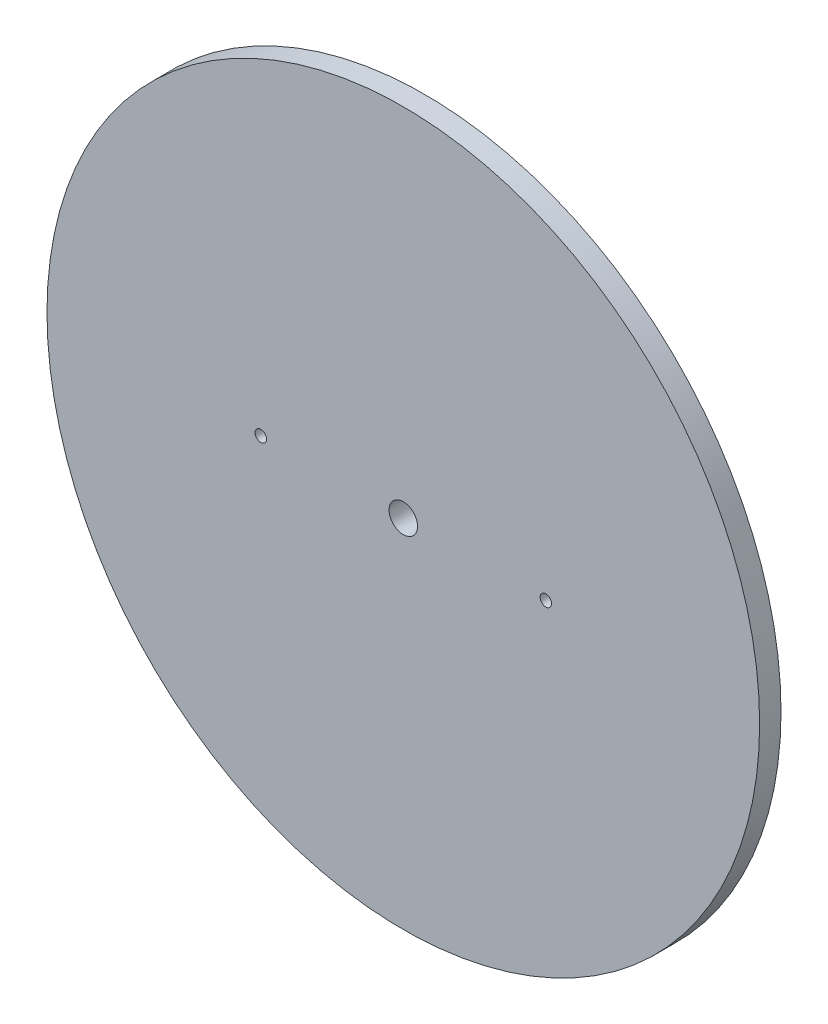
ISO-10303-21;
HEADER;
FILE_DESCRIPTION(('STEP AP214'),'2;1');
FILE_NAME('part.step','',(''),(''),'','','');
FILE_SCHEMA(('AUTOMOTIVE_DESIGN { 1 0 10303 214 1 1 1 1 }'));
ENDSEC;
DATA;
#1=APPLICATION_CONTEXT('core data for automotive mechanical design processes');
#2=APPLICATION_PROTOCOL_DEFINITION('international standard','automotive_design',2000,#1);
#3=PRODUCT_CONTEXT('',#1,'mechanical');
#4=PRODUCT('Part','Part','',(#3));
#5=PRODUCT_RELATED_PRODUCT_CATEGORY('part','',(#4));
#6=PRODUCT_DEFINITION_FORMATION('','',#4);
#7=PRODUCT_DEFINITION_CONTEXT('part definition',#1,'design');
#8=PRODUCT_DEFINITION('design','',#6,#7);
#9=PRODUCT_DEFINITION_SHAPE('','',#8);
#10=(LENGTH_UNIT() NAMED_UNIT(*) SI_UNIT(.MILLI.,.METRE.));
#11=(NAMED_UNIT(*) PLANE_ANGLE_UNIT() SI_UNIT($,.RADIAN.));
#12=(NAMED_UNIT(*) SI_UNIT($,.STERADIAN.) SOLID_ANGLE_UNIT());
#13=UNCERTAINTY_MEASURE_WITH_UNIT(LENGTH_MEASURE(1.E-05),#10,'distance_accuracy_value','');
#14=(GEOMETRIC_REPRESENTATION_CONTEXT(3) GLOBAL_UNCERTAINTY_ASSIGNED_CONTEXT((#13)) GLOBAL_UNIT_ASSIGNED_CONTEXT((#10,
#11,#12)) REPRESENTATION_CONTEXT('',''));
#15=CARTESIAN_POINT('',(0.,0.,0.));
#16=DIRECTION('',(0.,0.,1.));
#17=DIRECTION('',(1.,0.,0.));
#18=AXIS2_PLACEMENT_3D('',#15,#16,#17);
#19=CARTESIAN_POINT('',(0.,0.,6.));
#20=DIRECTION('',(0.,0.,-1.));
#21=DIRECTION('',(-1.,0.,0.));
#22=AXIS2_PLACEMENT_3D('',#19,#20,#21);
#23=CYLINDRICAL_SURFACE('',#22,100.);
#24=CARTESIAN_POINT('',(0.,0.,6.));
#25=DIRECTION('',(0.,0.,1.));
#26=DIRECTION('',(1.,0.,0.));
#27=AXIS2_PLACEMENT_3D('',#24,#25,#26);
#28=CIRCLE('',#27,100.);
#29=CARTESIAN_POINT('',(100.,0.,6.));
#30=VERTEX_POINT('',#29);
#31=EDGE_CURVE('E10',#30,#30,#28,.T.);
#32=ORIENTED_EDGE('',*,*,#31,.F.);
#33=EDGE_LOOP('',(#32));
#34=FACE_BOUND('',#33,.T.);
#35=CARTESIAN_POINT('',(0.,0.,0.));
#36=DIRECTION('',(0.,0.,1.));
#37=DIRECTION('',(1.,0.,0.));
#38=AXIS2_PLACEMENT_3D('',#35,#36,#37);
#39=CIRCLE('',#38,100.);
#40=CARTESIAN_POINT('',(100.,0.,0.));
#41=VERTEX_POINT('',#40);
#42=EDGE_CURVE('E46',#41,#41,#39,.T.);
#43=ORIENTED_EDGE('',*,*,#42,.T.);
#44=EDGE_LOOP('',(#43));
#45=FACE_BOUND('',#44,.T.);
#46=ADVANCED_FACE('F43',(#34,#45),#23,.T.);
#47=CARTESIAN_POINT('',(0.,0.,6.));
#48=DIRECTION('',(0.,0.,1.));
#49=DIRECTION('',(1.,0.,0.));
#50=AXIS2_PLACEMENT_3D('',#47,#48,#49);
#51=PLANE('',#50);
#52=CARTESIAN_POINT('',(-40.,0.,6.));
#53=DIRECTION('',(0.,0.,1.));
#54=DIRECTION('',(1.,0.,0.));
#55=AXIS2_PLACEMENT_3D('',#52,#53,#54);
#56=CIRCLE('',#55,1.6);
#57=CARTESIAN_POINT('',(-38.4,0.,6.));
#58=VERTEX_POINT('',#57);
#59=EDGE_CURVE('E54',#58,#58,#56,.F.);
#60=ORIENTED_EDGE('',*,*,#59,.T.);
#61=EDGE_LOOP('',(#60));
#62=FACE_BOUND('',#61,.T.);
#63=CARTESIAN_POINT('',(40.,0.,6.));
#64=DIRECTION('',(0.,0.,1.));
#65=DIRECTION('',(1.,0.,0.));
#66=AXIS2_PLACEMENT_3D('',#63,#64,#65);
#67=CIRCLE('',#66,1.6);
#68=CARTESIAN_POINT('',(41.6,0.,6.));
#69=VERTEX_POINT('',#68);
#70=EDGE_CURVE('E58',#69,#69,#67,.F.);
#71=ORIENTED_EDGE('',*,*,#70,.T.);
#72=EDGE_LOOP('',(#71));
#73=FACE_BOUND('',#72,.T.);
#74=CARTESIAN_POINT('',(0.,0.,6.));
#75=DIRECTION('',(0.,0.,1.));
#76=DIRECTION('',(1.,0.,0.));
#77=AXIS2_PLACEMENT_3D('',#74,#75,#76);
#78=CIRCLE('',#77,4.);
#79=CARTESIAN_POINT('',(4.,0.,6.));
#80=VERTEX_POINT('',#79);
#81=EDGE_CURVE('E61',#80,#80,#78,.F.);
#82=ORIENTED_EDGE('',*,*,#81,.T.);
#83=EDGE_LOOP('',(#82));
#84=FACE_BOUND('',#83,.T.);
#85=ORIENTED_EDGE('',*,*,#31,.T.);
#86=EDGE_LOOP('',(#85));
#87=FACE_BOUND('',#86,.T.);
#88=ADVANCED_FACE('F99',(#62,#73,#84,#87),#51,.T.);
#89=CARTESIAN_POINT('',(0.,0.,0.));
#90=DIRECTION('',(0.,0.,1.));
#91=DIRECTION('',(1.,0.,0.));
#92=AXIS2_PLACEMENT_3D('',#89,#90,#91);
#93=PLANE('',#92);
#94=CARTESIAN_POINT('',(-40.,0.,0.));
#95=DIRECTION('',(0.,0.,1.));
#96=DIRECTION('',(1.,0.,0.));
#97=AXIS2_PLACEMENT_3D('',#94,#95,#96);
#98=CIRCLE('',#97,1.6);
#99=CARTESIAN_POINT('',(-38.4,0.,0.));
#100=VERTEX_POINT('',#99);
#101=EDGE_CURVE('E71',#100,#100,#98,.T.);
#102=ORIENTED_EDGE('',*,*,#101,.T.);
#103=EDGE_LOOP('',(#102));
#104=FACE_BOUND('',#103,.T.);
#105=CARTESIAN_POINT('',(40.,0.,0.));
#106=DIRECTION('',(0.,0.,1.));
#107=DIRECTION('',(1.,0.,0.));
#108=AXIS2_PLACEMENT_3D('',#105,#106,#107);
#109=CIRCLE('',#108,1.6);
#110=CARTESIAN_POINT('',(41.6,0.,0.));
#111=VERTEX_POINT('',#110);
#112=EDGE_CURVE('E75',#111,#111,#109,.T.);
#113=ORIENTED_EDGE('',*,*,#112,.T.);
#114=EDGE_LOOP('',(#113));
#115=FACE_BOUND('',#114,.T.);
#116=CARTESIAN_POINT('',(0.,0.,0.));
#117=DIRECTION('',(0.,0.,1.));
#118=DIRECTION('',(1.,0.,0.));
#119=AXIS2_PLACEMENT_3D('',#116,#117,#118);
#120=CIRCLE('',#119,4.);
#121=CARTESIAN_POINT('',(4.,0.,0.));
#122=VERTEX_POINT('',#121);
#123=EDGE_CURVE('E70',#122,#122,#120,.T.);
#124=ORIENTED_EDGE('',*,*,#123,.T.);
#125=EDGE_LOOP('',(#124));
#126=FACE_BOUND('',#125,.T.);
#127=ORIENTED_EDGE('',*,*,#42,.F.);
#128=EDGE_LOOP('',(#127));
#129=FACE_BOUND('',#128,.T.);
#130=ADVANCED_FACE('F84',(#104,#115,#126,#129),#93,.F.);
#131=CARTESIAN_POINT('',(0.,0.,7.));
#132=DIRECTION('',(0.,0.,-1.));
#133=DIRECTION('',(-1.,0.,0.));
#134=AXIS2_PLACEMENT_3D('',#131,#132,#133);
#135=CYLINDRICAL_SURFACE('',#134,4.);
#136=ORIENTED_EDGE('',*,*,#81,.F.);
#137=EDGE_LOOP('',(#136));
#138=FACE_BOUND('',#137,.T.);
#139=ORIENTED_EDGE('',*,*,#123,.F.);
#140=EDGE_LOOP('',(#139));
#141=FACE_BOUND('',#140,.T.);
#142=ADVANCED_FACE('F87',(#138,#141),#135,.F.);
#143=CARTESIAN_POINT('',(40.,0.,7.));
#144=DIRECTION('',(0.,0.,-1.));
#145=DIRECTION('',(-1.,0.,0.));
#146=AXIS2_PLACEMENT_3D('',#143,#144,#145);
#147=CYLINDRICAL_SURFACE('',#146,1.6);
#148=ORIENTED_EDGE('',*,*,#70,.F.);
#149=EDGE_LOOP('',(#148));
#150=FACE_BOUND('',#149,.T.);
#151=ORIENTED_EDGE('',*,*,#112,.F.);
#152=EDGE_LOOP('',(#151));
#153=FACE_BOUND('',#152,.T.);
#154=ADVANCED_FACE('F83',(#150,#153),#147,.F.);
#155=CARTESIAN_POINT('',(-40.,0.,7.));
#156=DIRECTION('',(0.,0.,-1.));
#157=DIRECTION('',(-1.,0.,0.));
#158=AXIS2_PLACEMENT_3D('',#155,#156,#157);
#159=CYLINDRICAL_SURFACE('',#158,1.6);
#160=ORIENTED_EDGE('',*,*,#59,.F.);
#161=EDGE_LOOP('',(#160));
#162=FACE_BOUND('',#161,.T.);
#163=ORIENTED_EDGE('',*,*,#101,.F.);
#164=EDGE_LOOP('',(#163));
#165=FACE_BOUND('',#164,.T.);
#166=ADVANCED_FACE('F88',(#162,#165),#159,.F.);
#167=CLOSED_SHELL('',(#46,#88,#130,#142,#154,#166));
#168=MANIFOLD_SOLID_BREP('B2',#167);
#169=ADVANCED_BREP_SHAPE_REPRESENTATION('',(#18,#168),#14);
#170=SHAPE_DEFINITION_REPRESENTATION(#9,#169);
ENDSEC;
END-ISO-10303-21;
